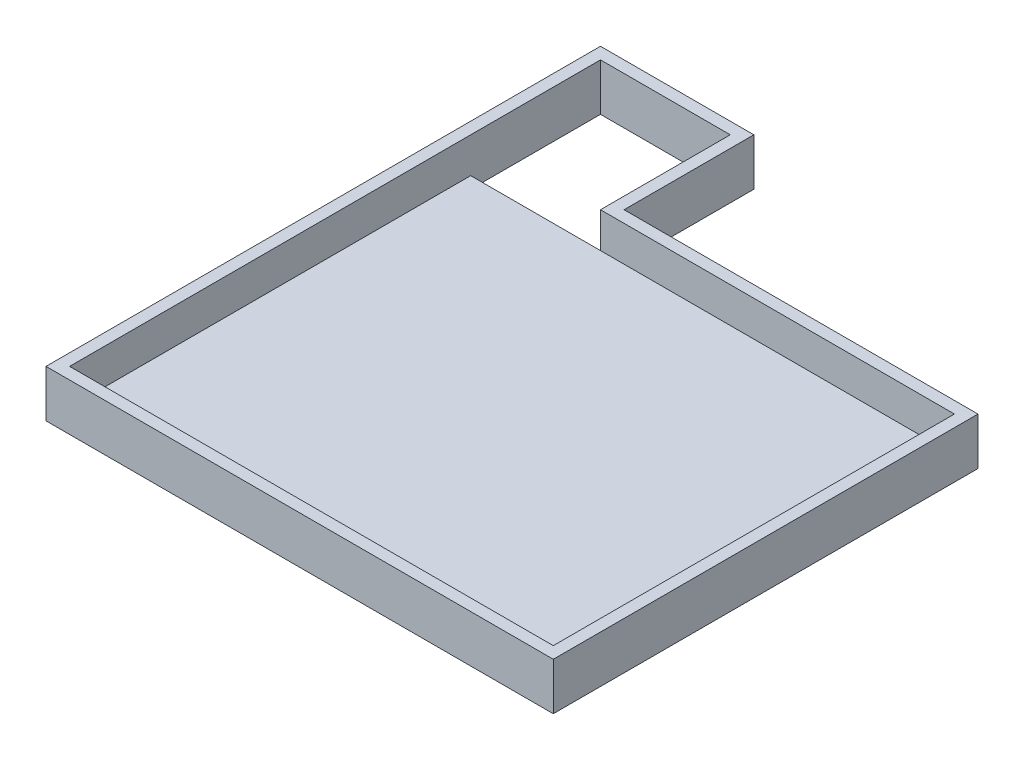
ISO-10303-21;
HEADER;
FILE_DESCRIPTION(('STEP AP214'),'2;1');
FILE_NAME('part.step','',(''),(''),'','','');
FILE_SCHEMA(('AUTOMOTIVE_DESIGN { 1 0 10303 214 1 1 1 1 }'));
ENDSEC;
DATA;
#1=APPLICATION_CONTEXT('core data for automotive mechanical design processes');
#2=APPLICATION_PROTOCOL_DEFINITION('international standard','automotive_design',2000,#1);
#3=PRODUCT_CONTEXT('',#1,'mechanical');
#4=PRODUCT('Part','Part','',(#3));
#5=PRODUCT_RELATED_PRODUCT_CATEGORY('part','',(#4));
#6=PRODUCT_DEFINITION_FORMATION('','',#4);
#7=PRODUCT_DEFINITION_CONTEXT('part definition',#1,'design');
#8=PRODUCT_DEFINITION('design','',#6,#7);
#9=PRODUCT_DEFINITION_SHAPE('','',#8);
#10=(LENGTH_UNIT() NAMED_UNIT(*) SI_UNIT(.MILLI.,.METRE.));
#11=(NAMED_UNIT(*) PLANE_ANGLE_UNIT() SI_UNIT($,.RADIAN.));
#12=(NAMED_UNIT(*) SI_UNIT($,.STERADIAN.) SOLID_ANGLE_UNIT());
#13=UNCERTAINTY_MEASURE_WITH_UNIT(LENGTH_MEASURE(1.E-05),#10,'distance_accuracy_value','');
#14=(GEOMETRIC_REPRESENTATION_CONTEXT(3) GLOBAL_UNCERTAINTY_ASSIGNED_CONTEXT((#13)) GLOBAL_UNIT_ASSIGNED_CONTEXT((#10,
#11,#12)) REPRESENTATION_CONTEXT('',''));
#15=CARTESIAN_POINT('',(0.,0.,0.));
#16=DIRECTION('',(0.,0.,1.));
#17=DIRECTION('',(1.,0.,0.));
#18=AXIS2_PLACEMENT_3D('',#15,#16,#17);
#19=CARTESIAN_POINT('',(-671.551659190435,5.,1448.34682594521));
#20=DIRECTION('',(1.,0.,0.));
#21=DIRECTION('',(0.,0.,-1.));
#22=AXIS2_PLACEMENT_3D('',#19,#20,#21);
#23=PLANE('',#22);
#24=DIRECTION('',(0.,0.,1.));
#25=VECTOR('',#24,1.);
#26=CARTESIAN_POINT('',(-671.551659190435,0.,1448.34682594521));
#27=LINE('',#26,#25);
#28=CARTESIAN_POINT('',(-671.551659190435,0.,1448.34682594521));
#29=VERTEX_POINT('',#28);
#30=CARTESIAN_POINT('',(-671.551659190435,0.,1683.34682594521));
#31=VERTEX_POINT('',#30);
#32=EDGE_CURVE('E261',#29,#31,#27,.T.);
#33=ORIENTED_EDGE('',*,*,#32,.T.);
#34=DIRECTION('',(0.,-1.,0.));
#35=VECTOR('',#34,1.);
#36=CARTESIAN_POINT('',(-671.551659190435,5.,1683.34682594521));
#37=LINE('',#36,#35);
#38=CARTESIAN_POINT('',(-671.551659190435,20.,1683.34682594521));
#39=VERTEX_POINT('',#38);
#40=EDGE_CURVE('E12',#39,#31,#37,.T.);
#41=ORIENTED_EDGE('',*,*,#40,.F.);
#42=DIRECTION('',(0.,0.,1.));
#43=VECTOR('',#42,1.);
#44=CARTESIAN_POINT('',(-671.551659190435,20.,1448.34682594521));
#45=LINE('',#44,#43);
#46=CARTESIAN_POINT('',(-671.551659190435,20.,1448.34682594521));
#47=VERTEX_POINT('',#46);
#48=EDGE_CURVE('E246',#47,#39,#45,.T.);
#49=ORIENTED_EDGE('',*,*,#48,.F.);
#50=DIRECTION('',(0.,-1.,0.));
#51=VECTOR('',#50,1.);
#52=CARTESIAN_POINT('',(-671.551659190435,5.,1448.34682594521));
#53=LINE('',#52,#51);
#54=EDGE_CURVE('E274',#47,#29,#53,.T.);
#55=ORIENTED_EDGE('',*,*,#54,.T.);
#56=EDGE_LOOP('',(#33,#41,#49,#55));
#57=FACE_BOUND('',#56,.T.);
#58=ADVANCED_FACE('F72',(#57),#23,.F.);
#59=CARTESIAN_POINT('',(-671.551659190435,5.,1683.34682594521));
#60=DIRECTION('',(0.,0.,-1.));
#61=DIRECTION('',(-1.,0.,0.));
#62=AXIS2_PLACEMENT_3D('',#59,#60,#61);
#63=PLANE('',#62);
#64=DIRECTION('',(1.,0.,0.));
#65=VECTOR('',#64,1.);
#66=CARTESIAN_POINT('',(-671.551659190435,0.,1683.34682594521));
#67=LINE('',#66,#65);
#68=CARTESIAN_POINT('',(-456.551659190435,0.,1683.34682594521));
#69=VERTEX_POINT('',#68);
#70=EDGE_CURVE('E267',#31,#69,#67,.T.);
#71=ORIENTED_EDGE('',*,*,#70,.T.);
#72=DIRECTION('',(0.,-1.,0.));
#73=VECTOR('',#72,1.);
#74=CARTESIAN_POINT('',(-456.551659190435,5.,1683.34682594521));
#75=LINE('',#74,#73);
#76=CARTESIAN_POINT('',(-456.551659190435,20.,1683.34682594521));
#77=VERTEX_POINT('',#76);
#78=EDGE_CURVE('E79',#77,#69,#75,.T.);
#79=ORIENTED_EDGE('',*,*,#78,.F.);
#80=DIRECTION('',(1.,0.,0.));
#81=VECTOR('',#80,1.);
#82=CARTESIAN_POINT('',(-671.551659190435,20.,1683.34682594521));
#83=LINE('',#82,#81);
#84=EDGE_CURVE('E249',#39,#77,#83,.T.);
#85=ORIENTED_EDGE('',*,*,#84,.F.);
#86=ORIENTED_EDGE('',*,*,#40,.T.);
#87=EDGE_LOOP('',(#71,#79,#85,#86));
#88=FACE_BOUND('',#87,.T.);
#89=ADVANCED_FACE('F301',(#88),#63,.F.);
#90=CARTESIAN_POINT('',(-456.551659190435,5.,1448.34682594521));
#91=DIRECTION('',(-1.,0.,0.));
#92=DIRECTION('',(0.,0.,1.));
#93=AXIS2_PLACEMENT_3D('',#90,#91,#92);
#94=PLANE('',#93);
#95=DIRECTION('',(0.,0.,-1.));
#96=VECTOR('',#95,1.);
#97=CARTESIAN_POINT('',(-456.551659190435,0.,1448.34682594521));
#98=LINE('',#97,#96);
#99=CARTESIAN_POINT('',(-456.551659190435,0.,1503.34682594521));
#100=VERTEX_POINT('',#99);
#101=EDGE_CURVE('E269',#69,#100,#98,.T.);
#102=ORIENTED_EDGE('',*,*,#101,.T.);
#103=DIRECTION('',(0.,1.,0.));
#104=VECTOR('',#103,1.);
#105=CARTESIAN_POINT('',(-456.551659190435,0.,1503.34682594521));
#106=LINE('',#105,#104);
#107=CARTESIAN_POINT('',(-456.551659190435,20.,1503.34682594521));
#108=VERTEX_POINT('',#107);
#109=EDGE_CURVE('E259',#100,#108,#106,.T.);
#110=ORIENTED_EDGE('',*,*,#109,.T.);
#111=DIRECTION('',(0.,0.,-1.));
#112=VECTOR('',#111,1.);
#113=CARTESIAN_POINT('',(-456.551659190435,20.,1683.34682594521));
#114=LINE('',#113,#112);
#115=EDGE_CURVE('E234',#77,#108,#114,.T.);
#116=ORIENTED_EDGE('',*,*,#115,.F.);
#117=ORIENTED_EDGE('',*,*,#78,.T.);
#118=EDGE_LOOP('',(#102,#110,#116,#117));
#119=FACE_BOUND('',#118,.T.);
#120=ADVANCED_FACE('F280',(#119),#94,.F.);
#121=CARTESIAN_POINT('',(-671.551659190435,5.,1448.34682594521));
#122=DIRECTION('',(0.,0.,1.));
#123=DIRECTION('',(1.,0.,0.));
#124=AXIS2_PLACEMENT_3D('',#121,#122,#123);
#125=PLANE('',#124);
#126=ORIENTED_EDGE('',*,*,#54,.F.);
#127=DIRECTION('',(-1.,0.,0.));
#128=VECTOR('',#127,1.);
#129=CARTESIAN_POINT('',(-606.551659190435,20.,1448.34682594521));
#130=LINE('',#129,#128);
#131=CARTESIAN_POINT('',(-606.551659190435,20.,1448.34682594521));
#132=VERTEX_POINT('',#131);
#133=EDGE_CURVE('E243',#132,#47,#130,.T.);
#134=ORIENTED_EDGE('',*,*,#133,.F.);
#135=DIRECTION('',(0.,1.,0.));
#136=VECTOR('',#135,1.);
#137=CARTESIAN_POINT('',(-606.551659190435,0.,1448.34682594521));
#138=LINE('',#137,#136);
#139=CARTESIAN_POINT('',(-606.551659190435,0.,1448.34682594521));
#140=VERTEX_POINT('',#139);
#141=EDGE_CURVE('E258',#140,#132,#138,.T.);
#142=ORIENTED_EDGE('',*,*,#141,.F.);
#143=DIRECTION('',(-1.,0.,0.));
#144=VECTOR('',#143,1.);
#145=CARTESIAN_POINT('',(-671.551659190435,0.,1448.34682594521));
#146=LINE('',#145,#144);
#147=EDGE_CURVE('E272',#140,#29,#146,.T.);
#148=ORIENTED_EDGE('',*,*,#147,.T.);
#149=EDGE_LOOP('',(#126,#134,#142,#148));
#150=FACE_BOUND('',#149,.T.);
#151=ADVANCED_FACE('F299',(#150),#125,.F.);
#152=CARTESIAN_POINT('',(0.,0.,0.));
#153=DIRECTION('',(0.,1.,0.));
#154=DIRECTION('',(0.,0.,1.));
#155=AXIS2_PLACEMENT_3D('',#152,#153,#154);
#156=PLANE('',#155);
#157=DIRECTION('',(1.,0.,0.));
#158=VECTOR('',#157,1.);
#159=CARTESIAN_POINT('',(-611.551659190435,0.,1508.34682594521));
#160=LINE('',#159,#158);
#161=CARTESIAN_POINT('',(-666.551659190435,0.,1508.34682594521));
#162=VERTEX_POINT('',#161);
#163=CARTESIAN_POINT('',(-611.551659190435,0.,1508.34682594521));
#164=VERTEX_POINT('',#163);
#165=EDGE_CURVE('E191',#162,#164,#160,.T.);
#166=ORIENTED_EDGE('',*,*,#165,.T.);
#167=DIRECTION('',(0.,0.,-1.));
#168=VECTOR('',#167,1.);
#169=CARTESIAN_POINT('',(-611.551659190435,0.,1453.34682594521));
#170=LINE('',#169,#168);
#171=CARTESIAN_POINT('',(-611.551659190435,0.,1453.34682594521));
#172=VERTEX_POINT('',#171);
#173=EDGE_CURVE('E174',#164,#172,#170,.T.);
#174=ORIENTED_EDGE('',*,*,#173,.T.);
#175=DIRECTION('',(-1.,0.,0.));
#176=VECTOR('',#175,1.);
#177=CARTESIAN_POINT('',(-611.551659190435,0.,1453.34682594521));
#178=LINE('',#177,#176);
#179=CARTESIAN_POINT('',(-666.551659190435,0.,1453.34682594521));
#180=VERTEX_POINT('',#179);
#181=EDGE_CURVE('E183',#172,#180,#178,.T.);
#182=ORIENTED_EDGE('',*,*,#181,.T.);
#183=DIRECTION('',(0.,0.,1.));
#184=VECTOR('',#183,1.);
#185=CARTESIAN_POINT('',(-666.551659190435,0.,1453.34682594521));
#186=LINE('',#185,#184);
#187=EDGE_CURVE('E187',#180,#162,#186,.T.);
#188=ORIENTED_EDGE('',*,*,#187,.T.);
#189=EDGE_LOOP('',(#166,#174,#182,#188));
#190=FACE_BOUND('',#189,.T.);
#191=DIRECTION('',(0.,0.,1.));
#192=VECTOR('',#191,1.);
#193=CARTESIAN_POINT('',(-606.551659190435,0.,1448.34682594521));
#194=LINE('',#193,#192);
#195=CARTESIAN_POINT('',(-606.551659190435,0.,1503.34682594521));
#196=VERTEX_POINT('',#195);
#197=EDGE_CURVE('E252',#140,#196,#194,.T.);
#198=ORIENTED_EDGE('',*,*,#197,.T.);
#199=DIRECTION('',(1.,0.,0.));
#200=VECTOR('',#199,1.);
#201=CARTESIAN_POINT('',(-456.551659190435,0.,1503.34682594521));
#202=LINE('',#201,#200);
#203=EDGE_CURVE('E255',#196,#100,#202,.T.);
#204=ORIENTED_EDGE('',*,*,#203,.T.);
#205=ORIENTED_EDGE('',*,*,#101,.F.);
#206=ORIENTED_EDGE('',*,*,#70,.F.);
#207=ORIENTED_EDGE('',*,*,#32,.F.);
#208=ORIENTED_EDGE('',*,*,#147,.F.);
#209=EDGE_LOOP('',(#198,#204,#205,#206,#207,#208));
#210=FACE_BOUND('',#209,.T.);
#211=ADVANCED_FACE('F189',(#190,#210),#156,.F.);
#212=CARTESIAN_POINT('',(-456.551659190435,0.,1503.34682594521));
#213=DIRECTION('',(0.,0.,1.));
#214=DIRECTION('',(1.,0.,0.));
#215=AXIS2_PLACEMENT_3D('',#212,#213,#214);
#216=PLANE('',#215);
#217=DIRECTION('',(0.,1.,0.));
#218=VECTOR('',#217,1.);
#219=CARTESIAN_POINT('',(-606.551659190435,0.,1503.34682594521));
#220=LINE('',#219,#218);
#221=CARTESIAN_POINT('',(-606.551659190435,20.,1503.34682594521));
#222=VERTEX_POINT('',#221);
#223=EDGE_CURVE('E262',#196,#222,#220,.T.);
#224=ORIENTED_EDGE('',*,*,#223,.T.);
#225=DIRECTION('',(-1.,0.,0.));
#226=VECTOR('',#225,1.);
#227=CARTESIAN_POINT('',(-456.551659190435,20.,1503.34682594521));
#228=LINE('',#227,#226);
#229=EDGE_CURVE('E237',#108,#222,#228,.T.);
#230=ORIENTED_EDGE('',*,*,#229,.F.);
#231=ORIENTED_EDGE('',*,*,#109,.F.);
#232=ORIENTED_EDGE('',*,*,#203,.F.);
#233=EDGE_LOOP('',(#224,#230,#231,#232));
#234=FACE_BOUND('',#233,.T.);
#235=ADVANCED_FACE('F287',(#234),#216,.F.);
#236=CARTESIAN_POINT('',(-606.551659190435,0.,1448.34682594521));
#237=DIRECTION('',(-1.,0.,0.));
#238=DIRECTION('',(0.,0.,1.));
#239=AXIS2_PLACEMENT_3D('',#236,#237,#238);
#240=PLANE('',#239);
#241=ORIENTED_EDGE('',*,*,#141,.T.);
#242=DIRECTION('',(0.,0.,-1.));
#243=VECTOR('',#242,1.);
#244=CARTESIAN_POINT('',(-606.551659190435,20.,1503.34682594521));
#245=LINE('',#244,#243);
#246=EDGE_CURVE('E240',#222,#132,#245,.T.);
#247=ORIENTED_EDGE('',*,*,#246,.F.);
#248=ORIENTED_EDGE('',*,*,#223,.F.);
#249=ORIENTED_EDGE('',*,*,#197,.F.);
#250=EDGE_LOOP('',(#241,#247,#248,#249));
#251=FACE_BOUND('',#250,.T.);
#252=ADVANCED_FACE('F291',(#251),#240,.F.);
#253=CARTESIAN_POINT('',(0.,20.,0.));
#254=DIRECTION('',(0.,1.,0.));
#255=DIRECTION('',(0.,0.,1.));
#256=AXIS2_PLACEMENT_3D('',#253,#254,#255);
#257=PLANE('',#256);
#258=ORIENTED_EDGE('',*,*,#115,.T.);
#259=ORIENTED_EDGE('',*,*,#229,.T.);
#260=ORIENTED_EDGE('',*,*,#246,.T.);
#261=ORIENTED_EDGE('',*,*,#133,.T.);
#262=ORIENTED_EDGE('',*,*,#48,.T.);
#263=ORIENTED_EDGE('',*,*,#84,.T.);
#264=EDGE_LOOP('',(#258,#259,#260,#261,#262,#263));
#265=FACE_BOUND('',#264,.T.);
#266=DIRECTION('',(-1.,0.,0.));
#267=VECTOR('',#266,1.);
#268=CARTESIAN_POINT('',(-456.551659190435,20.,1508.34682594521));
#269=LINE('',#268,#267);
#270=CARTESIAN_POINT('',(-461.551659190435,20.,1508.34682594521));
#271=VERTEX_POINT('',#270);
#272=CARTESIAN_POINT('',(-611.551659190435,20.,1508.34682594521));
#273=VERTEX_POINT('',#272);
#274=EDGE_CURVE('E204',#271,#273,#269,.T.);
#275=ORIENTED_EDGE('',*,*,#274,.F.);
#276=DIRECTION('',(0.,0.,-1.));
#277=VECTOR('',#276,1.);
#278=CARTESIAN_POINT('',(-461.551659190435,20.,1683.34682594521));
#279=LINE('',#278,#277);
#280=CARTESIAN_POINT('',(-461.551659190435,20.,1678.34682594521));
#281=VERTEX_POINT('',#280);
#282=EDGE_CURVE('E202',#281,#271,#279,.T.);
#283=ORIENTED_EDGE('',*,*,#282,.F.);
#284=DIRECTION('',(1.,0.,0.));
#285=VECTOR('',#284,1.);
#286=CARTESIAN_POINT('',(-671.551659190435,20.,1678.34682594521));
#287=LINE('',#286,#285);
#288=CARTESIAN_POINT('',(-666.551659190435,20.,1678.34682594521));
#289=VERTEX_POINT('',#288);
#290=EDGE_CURVE('E213',#289,#281,#287,.T.);
#291=ORIENTED_EDGE('',*,*,#290,.F.);
#292=DIRECTION('',(0.,0.,1.));
#293=VECTOR('',#292,1.);
#294=CARTESIAN_POINT('',(-666.551659190435,20.,1448.34682594521));
#295=LINE('',#294,#293);
#296=CARTESIAN_POINT('',(-666.551659190435,20.,1453.34682594521));
#297=VERTEX_POINT('',#296);
#298=EDGE_CURVE('E210',#297,#289,#295,.T.);
#299=ORIENTED_EDGE('',*,*,#298,.F.);
#300=DIRECTION('',(-1.,0.,0.));
#301=VECTOR('',#300,1.);
#302=CARTESIAN_POINT('',(-606.551659190435,20.,1453.34682594521));
#303=LINE('',#302,#301);
#304=CARTESIAN_POINT('',(-611.551659190435,20.,1453.34682594521));
#305=VERTEX_POINT('',#304);
#306=EDGE_CURVE('E208',#305,#297,#303,.T.);
#307=ORIENTED_EDGE('',*,*,#306,.F.);
#308=DIRECTION('',(0.,0.,-1.));
#309=VECTOR('',#308,1.);
#310=CARTESIAN_POINT('',(-611.551659190435,20.,1503.34682594521));
#311=LINE('',#310,#309);
#312=EDGE_CURVE('E178',#273,#305,#311,.T.);
#313=ORIENTED_EDGE('',*,*,#312,.F.);
#314=EDGE_LOOP('',(#275,#283,#291,#299,#307,#313));
#315=FACE_BOUND('',#314,.T.);
#316=ADVANCED_FACE('F295',(#265,#315),#257,.T.);
#317=CARTESIAN_POINT('',(-461.551659190435,20.,1683.34682594521));
#318=DIRECTION('',(-1.,0.,0.));
#319=DIRECTION('',(0.,0.,1.));
#320=AXIS2_PLACEMENT_3D('',#317,#318,#319);
#321=PLANE('',#320);
#322=DIRECTION('',(0.,0.,-1.));
#323=VECTOR('',#322,1.);
#324=CARTESIAN_POINT('',(-461.551659190435,5.,1683.34682594521));
#325=LINE('',#324,#323);
#326=CARTESIAN_POINT('',(-461.551659190435,5.,1678.34682594521));
#327=VERTEX_POINT('',#326);
#328=CARTESIAN_POINT('',(-461.551659190435,5.,1508.34682594521));
#329=VERTEX_POINT('',#328);
#330=EDGE_CURVE('E200',#327,#329,#325,.T.);
#331=ORIENTED_EDGE('',*,*,#330,.F.);
#332=DIRECTION('',(0.,-1.,0.));
#333=VECTOR('',#332,1.);
#334=CARTESIAN_POINT('',(-461.551659190435,20.,1678.34682594521));
#335=LINE('',#334,#333);
#336=EDGE_CURVE('E215',#281,#327,#335,.T.);
#337=ORIENTED_EDGE('',*,*,#336,.F.);
#338=ORIENTED_EDGE('',*,*,#282,.T.);
#339=DIRECTION('',(0.,-1.,0.));
#340=VECTOR('',#339,1.);
#341=CARTESIAN_POINT('',(-461.551659190435,20.,1508.34682594521));
#342=LINE('',#341,#340);
#343=EDGE_CURVE('E231',#271,#329,#342,.T.);
#344=ORIENTED_EDGE('',*,*,#343,.T.);
#345=EDGE_LOOP('',(#331,#337,#338,#344));
#346=FACE_BOUND('',#345,.T.);
#347=ADVANCED_FACE('F325',(#346),#321,.T.);
#348=CARTESIAN_POINT('',(-456.551659190435,20.,1508.34682594521));
#349=DIRECTION('',(0.,0.,1.));
#350=DIRECTION('',(1.,0.,0.));
#351=AXIS2_PLACEMENT_3D('',#348,#349,#350);
#352=PLANE('',#351);
#353=DIRECTION('',(-1.,0.,0.));
#354=VECTOR('',#353,1.);
#355=CARTESIAN_POINT('',(-456.551659190435,5.,1508.34682594521));
#356=LINE('',#355,#354);
#357=CARTESIAN_POINT('',(-611.551659190435,5.,1508.34682594521));
#358=VERTEX_POINT('',#357);
#359=EDGE_CURVE('E217',#329,#358,#356,.T.);
#360=ORIENTED_EDGE('',*,*,#359,.F.);
#361=ORIENTED_EDGE('',*,*,#343,.F.);
#362=ORIENTED_EDGE('',*,*,#274,.T.);
#363=DIRECTION('',(0.,-1.,0.));
#364=VECTOR('',#363,1.);
#365=CARTESIAN_POINT('',(-611.551659190435,20.,1508.34682594521));
#366=LINE('',#365,#364);
#367=EDGE_CURVE('E180',#273,#358,#366,.T.);
#368=ORIENTED_EDGE('',*,*,#367,.T.);
#369=EDGE_LOOP('',(#360,#361,#362,#368));
#370=FACE_BOUND('',#369,.T.);
#371=ADVANCED_FACE('F328',(#370),#352,.T.);
#372=CARTESIAN_POINT('',(-611.551659190435,20.,1503.34682594521));
#373=DIRECTION('',(-1.,0.,0.));
#374=DIRECTION('',(0.,0.,1.));
#375=AXIS2_PLACEMENT_3D('',#372,#373,#374);
#376=PLANE('',#375);
#377=DIRECTION('',(0.,-1.,0.));
#378=VECTOR('',#377,1.);
#379=CARTESIAN_POINT('',(-611.551659190435,20.,1453.34682594521));
#380=LINE('',#379,#378);
#381=EDGE_CURVE('E171',#305,#172,#380,.T.);
#382=ORIENTED_EDGE('',*,*,#381,.T.);
#383=ORIENTED_EDGE('',*,*,#173,.F.);
#384=DIRECTION('',(0.,1.,0.));
#385=VECTOR('',#384,1.);
#386=CARTESIAN_POINT('',(-611.551659190435,0.,1508.34682594521));
#387=LINE('',#386,#385);
#388=EDGE_CURVE('E198',#164,#358,#387,.T.);
#389=ORIENTED_EDGE('',*,*,#388,.T.);
#390=ORIENTED_EDGE('',*,*,#367,.F.);
#391=ORIENTED_EDGE('',*,*,#312,.T.);
#392=EDGE_LOOP('',(#382,#383,#389,#390,#391));
#393=FACE_BOUND('',#392,.T.);
#394=ADVANCED_FACE('F172',(#393),#376,.T.);
#395=CARTESIAN_POINT('',(-606.551659190435,20.,1453.34682594521));
#396=DIRECTION('',(0.,0.,1.));
#397=DIRECTION('',(1.,0.,0.));
#398=AXIS2_PLACEMENT_3D('',#395,#396,#397);
#399=PLANE('',#398);
#400=DIRECTION('',(0.,-1.,0.));
#401=VECTOR('',#400,1.);
#402=CARTESIAN_POINT('',(-666.551659190435,20.,1453.34682594521));
#403=LINE('',#402,#401);
#404=EDGE_CURVE('E94',#297,#180,#403,.T.);
#405=ORIENTED_EDGE('',*,*,#404,.T.);
#406=ORIENTED_EDGE('',*,*,#181,.F.);
#407=ORIENTED_EDGE('',*,*,#381,.F.);
#408=ORIENTED_EDGE('',*,*,#306,.T.);
#409=EDGE_LOOP('',(#405,#406,#407,#408));
#410=FACE_BOUND('',#409,.T.);
#411=ADVANCED_FACE('F184',(#410),#399,.T.);
#412=CARTESIAN_POINT('',(-666.551659190435,20.,1448.34682594521));
#413=DIRECTION('',(1.,0.,0.));
#414=DIRECTION('',(0.,0.,-1.));
#415=AXIS2_PLACEMENT_3D('',#412,#413,#414);
#416=PLANE('',#415);
#417=DIRECTION('',(0.,0.,1.));
#418=VECTOR('',#417,1.);
#419=CARTESIAN_POINT('',(-666.551659190435,5.,1448.34682594521));
#420=LINE('',#419,#418);
#421=CARTESIAN_POINT('',(-666.551659190435,5.,1508.34682594521));
#422=VERTEX_POINT('',#421);
#423=CARTESIAN_POINT('',(-666.551659190435,5.,1678.34682594521));
#424=VERTEX_POINT('',#423);
#425=EDGE_CURVE('E220',#422,#424,#420,.T.);
#426=ORIENTED_EDGE('',*,*,#425,.F.);
#427=DIRECTION('',(0.,1.,0.));
#428=VECTOR('',#427,1.);
#429=CARTESIAN_POINT('',(-666.551659190435,0.,1508.34682594521));
#430=LINE('',#429,#428);
#431=EDGE_CURVE('E86',#162,#422,#430,.T.);
#432=ORIENTED_EDGE('',*,*,#431,.F.);
#433=ORIENTED_EDGE('',*,*,#187,.F.);
#434=ORIENTED_EDGE('',*,*,#404,.F.);
#435=ORIENTED_EDGE('',*,*,#298,.T.);
#436=DIRECTION('',(0.,-1.,0.));
#437=VECTOR('',#436,1.);
#438=CARTESIAN_POINT('',(-666.551659190435,20.,1678.34682594521));
#439=LINE('',#438,#437);
#440=EDGE_CURVE('E225',#289,#424,#439,.T.);
#441=ORIENTED_EDGE('',*,*,#440,.T.);
#442=EDGE_LOOP('',(#426,#432,#433,#434,#435,#441));
#443=FACE_BOUND('',#442,.T.);
#444=ADVANCED_FACE('F337',(#443),#416,.T.);
#445=CARTESIAN_POINT('',(-671.551659190435,20.,1678.34682594521));
#446=DIRECTION('',(0.,0.,-1.));
#447=DIRECTION('',(-1.,0.,0.));
#448=AXIS2_PLACEMENT_3D('',#445,#446,#447);
#449=PLANE('',#448);
#450=DIRECTION('',(1.,0.,0.));
#451=VECTOR('',#450,1.);
#452=CARTESIAN_POINT('',(-671.551659190435,5.,1678.34682594521));
#453=LINE('',#452,#451);
#454=EDGE_CURVE('E205',#424,#327,#453,.T.);
#455=ORIENTED_EDGE('',*,*,#454,.F.);
#456=ORIENTED_EDGE('',*,*,#440,.F.);
#457=ORIENTED_EDGE('',*,*,#290,.T.);
#458=ORIENTED_EDGE('',*,*,#336,.T.);
#459=EDGE_LOOP('',(#455,#456,#457,#458));
#460=FACE_BOUND('',#459,.T.);
#461=ADVANCED_FACE('F317',(#460),#449,.T.);
#462=CARTESIAN_POINT('',(0.,5.,0.));
#463=DIRECTION('',(0.,1.,0.));
#464=DIRECTION('',(0.,0.,1.));
#465=AXIS2_PLACEMENT_3D('',#462,#463,#464);
#466=PLANE('',#465);
#467=DIRECTION('',(1.,0.,0.));
#468=VECTOR('',#467,1.);
#469=CARTESIAN_POINT('',(-611.551659190435,5.,1508.34682594521));
#470=LINE('',#469,#468);
#471=EDGE_CURVE('E192',#422,#358,#470,.T.);
#472=ORIENTED_EDGE('',*,*,#471,.F.);
#473=ORIENTED_EDGE('',*,*,#425,.T.);
#474=ORIENTED_EDGE('',*,*,#454,.T.);
#475=ORIENTED_EDGE('',*,*,#330,.T.);
#476=ORIENTED_EDGE('',*,*,#359,.T.);
#477=EDGE_LOOP('',(#472,#473,#474,#475,#476));
#478=FACE_BOUND('',#477,.T.);
#479=ADVANCED_FACE('F313',(#478),#466,.T.);
#480=CARTESIAN_POINT('',(-611.551659190435,0.,1508.34682594521));
#481=DIRECTION('',(0.,0.,1.));
#482=DIRECTION('',(1.,0.,0.));
#483=AXIS2_PLACEMENT_3D('',#480,#481,#482);
#484=PLANE('',#483);
#485=ORIENTED_EDGE('',*,*,#471,.T.);
#486=ORIENTED_EDGE('',*,*,#388,.F.);
#487=ORIENTED_EDGE('',*,*,#165,.F.);
#488=ORIENTED_EDGE('',*,*,#431,.T.);
#489=EDGE_LOOP('',(#485,#486,#487,#488));
#490=FACE_BOUND('',#489,.T.);
#491=ADVANCED_FACE('F316',(#490),#484,.F.);
#492=CLOSED_SHELL('',(#58,#89,#120,#151,#211,#235,#252,#316,#347,#371,#394,#411,#444,#461,#479,#491));
#493=MANIFOLD_SOLID_BREP('B2',#492);
#494=ADVANCED_BREP_SHAPE_REPRESENTATION('',(#18,#493),#14);
#495=SHAPE_DEFINITION_REPRESENTATION(#9,#494);
ENDSEC;
END-ISO-10303-21;
